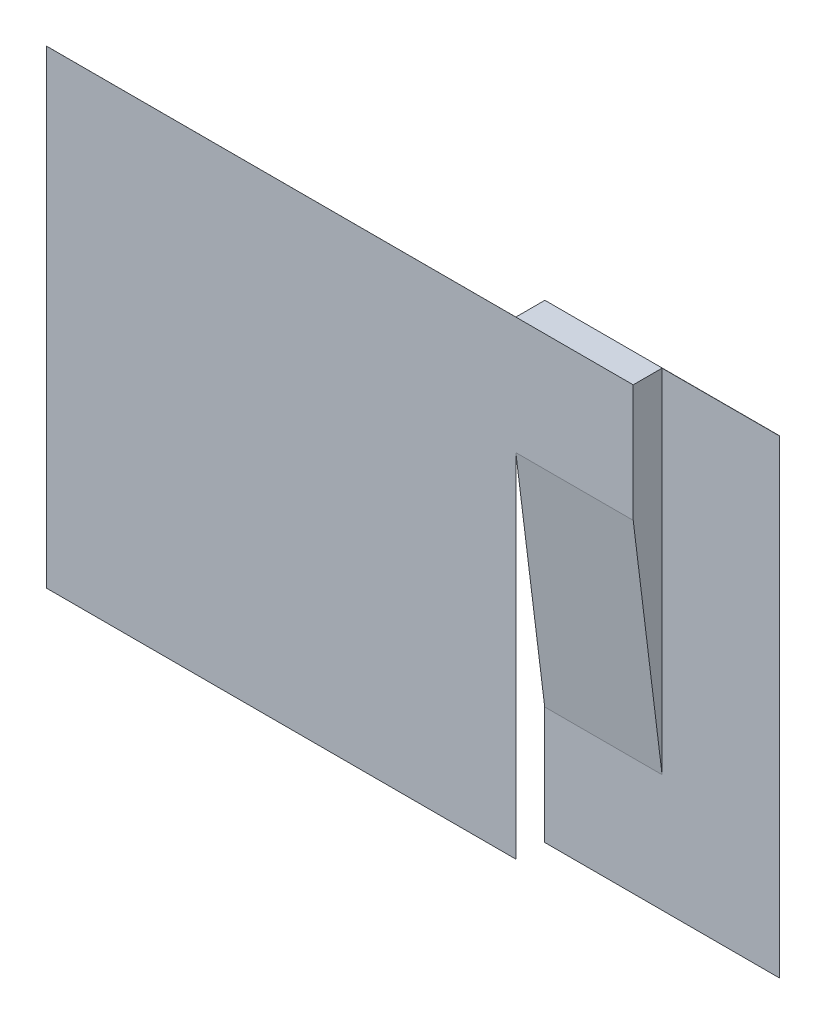
ISO-10303-21;
HEADER;
FILE_DESCRIPTION(('STEP AP214'),'2;1');
FILE_NAME('part.step','',(''),(''),'','','');
FILE_SCHEMA(('AUTOMOTIVE_DESIGN { 1 0 10303 214 1 1 1 1 }'));
ENDSEC;
DATA;
#1=APPLICATION_CONTEXT('core data for automotive mechanical design processes');
#2=APPLICATION_PROTOCOL_DEFINITION('international standard','automotive_design',2000,#1);
#3=PRODUCT_CONTEXT('',#1,'mechanical');
#4=PRODUCT('Part','Part','',(#3));
#5=PRODUCT_RELATED_PRODUCT_CATEGORY('part','',(#4));
#6=PRODUCT_DEFINITION_FORMATION('','',#4);
#7=PRODUCT_DEFINITION_CONTEXT('part definition',#1,'design');
#8=PRODUCT_DEFINITION('design','',#6,#7);
#9=PRODUCT_DEFINITION_SHAPE('','',#8);
#10=(LENGTH_UNIT() NAMED_UNIT(*) SI_UNIT(.MILLI.,.METRE.));
#11=(NAMED_UNIT(*) PLANE_ANGLE_UNIT() SI_UNIT($,.RADIAN.));
#12=(NAMED_UNIT(*) SI_UNIT($,.STERADIAN.) SOLID_ANGLE_UNIT());
#13=UNCERTAINTY_MEASURE_WITH_UNIT(LENGTH_MEASURE(1.E-05),#10,'distance_accuracy_value','');
#14=(GEOMETRIC_REPRESENTATION_CONTEXT(3) GLOBAL_UNCERTAINTY_ASSIGNED_CONTEXT((#13)) GLOBAL_UNIT_ASSIGNED_CONTEXT((#10,
#11,#12)) REPRESENTATION_CONTEXT('',''));
#15=CARTESIAN_POINT('',(0.,0.,0.));
#16=DIRECTION('',(0.,0.,1.));
#17=DIRECTION('',(1.,0.,0.));
#18=AXIS2_PLACEMENT_3D('',#15,#16,#17);
#19=CARTESIAN_POINT('',(305.,-1291.8204832077,-424.609273672104));
#20=DIRECTION('',(0.,-0.122031907108363,0.992526177814719));
#21=DIRECTION('',(0.,-0.992526177814719,-0.122031907108363));
#22=AXIS2_PLACEMENT_3D('',#19,#20,#21);
#23=PLANE('',#22);
#24=DIRECTION('',(0.,-0.992526177814719,-0.122031907108363));
#25=VECTOR('',#24,1.);
#26=CARTESIAN_POINT('',(-305.,-1291.8204832077,-424.609273672104));
#27=LINE('',#26,#25);
#28=CARTESIAN_POINT('',(-305.,-72.6338165409989,-274.709273672104));
#29=VERTEX_POINT('',#28);
#30=CARTESIAN_POINT('',(-305.,-71.8204832076668,-274.609273672104));
#31=VERTEX_POINT('',#30);
#32=EDGE_CURVE('E136',#29,#31,#27,.F.);
#33=ORIENTED_EDGE('',*,*,#32,.F.);
#34=DIRECTION('',(0.,-0.992526177814719,-0.122031907108363));
#35=VECTOR('',#34,1.);
#36=CARTESIAN_POINT('',(-305.,-1291.8204832077,-424.609273672104));
#37=LINE('',#36,#35);
#38=CARTESIAN_POINT('',(-305.,-1291.8204832077,-424.609273672104));
#39=VERTEX_POINT('',#38);
#40=EDGE_CURVE('E36',#39,#29,#37,.F.);
#41=ORIENTED_EDGE('',*,*,#40,.F.);
#42=DIRECTION('',(-1.,0.,0.));
#43=VECTOR('',#42,1.);
#44=CARTESIAN_POINT('',(305.,-1291.8204832077,-424.609273672104));
#45=LINE('',#44,#43);
#46=CARTESIAN_POINT('',(305.,-1291.8204832077,-424.609273672104));
#47=VERTEX_POINT('',#46);
#48=EDGE_CURVE('E140',#47,#39,#45,.T.);
#49=ORIENTED_EDGE('',*,*,#48,.F.);
#50=DIRECTION('',(0.,0.992526177814719,0.122031907108363));
#51=VECTOR('',#50,1.);
#52=CARTESIAN_POINT('',(305.,-1291.8204832077,-424.609273672104));
#53=LINE('',#52,#51);
#54=CARTESIAN_POINT('',(305.,-71.8204832076659,-274.609273672104));
#55=VERTEX_POINT('',#54);
#56=EDGE_CURVE('E139',#55,#47,#53,.F.);
#57=ORIENTED_EDGE('',*,*,#56,.F.);
#58=DIRECTION('',(-1.,0.,0.));
#59=VECTOR('',#58,1.);
#60=CARTESIAN_POINT('',(304.999999999998,-71.8204832076659,-274.609273672104));
#61=LINE('',#60,#59);
#62=EDGE_CURVE('E69',#31,#55,#61,.F.);
#63=ORIENTED_EDGE('',*,*,#62,.F.);
#64=EDGE_LOOP('',(#33,#41,#49,#57,#63));
#65=FACE_BOUND('',#64,.T.);
#66=ADVANCED_FACE('F33',(#65),#23,.T.);
#67=CARTESIAN_POINT('',(0.,0.,-424.609273672104));
#68=DIRECTION('',(0.,0.,-1.));
#69=DIRECTION('',(-1.,0.,0.));
#70=AXIS2_PLACEMENT_3D('',#67,#68,#69);
#71=PLANE('',#70);
#72=DIRECTION('',(0.,1.,0.));
#73=VECTOR('',#72,1.);
#74=CARTESIAN_POINT('',(305.,-1291.8204832077,-424.609273672104));
#75=LINE('',#74,#73);
#76=CARTESIAN_POINT('',(305.,538.179516792297,-424.609273672104));
#77=VERTEX_POINT('',#76);
#78=EDGE_CURVE('E80',#47,#77,#75,.T.);
#79=ORIENTED_EDGE('',*,*,#78,.F.);
#80=ORIENTED_EDGE('',*,*,#48,.T.);
#81=DIRECTION('',(0.,1.,0.));
#82=VECTOR('',#81,1.);
#83=CARTESIAN_POINT('',(-305.,-1901.82048320771,-424.609273672104));
#84=LINE('',#83,#82);
#85=CARTESIAN_POINT('',(-305.,-1901.82048320771,-424.609273672104));
#86=VERTEX_POINT('',#85);
#87=EDGE_CURVE('E162',#86,#39,#84,.T.);
#88=ORIENTED_EDGE('',*,*,#87,.F.);
#89=DIRECTION('',(-1.,0.,0.));
#90=VECTOR('',#89,1.);
#91=CARTESIAN_POINT('',(915.,-1901.82048320771,-424.609273672104));
#92=LINE('',#91,#90);
#93=CARTESIAN_POINT('',(915.,-1901.82048320771,-424.609273672104));
#94=VERTEX_POINT('',#93);
#95=EDGE_CURVE('E127',#94,#86,#92,.T.);
#96=ORIENTED_EDGE('',*,*,#95,.F.);
#97=DIRECTION('',(0.,-1.,0.));
#98=VECTOR('',#97,1.);
#99=CARTESIAN_POINT('',(915.,538.179516792297,-424.609273672104));
#100=LINE('',#99,#98);
#101=CARTESIAN_POINT('',(915.,538.179516792297,-424.609273672104));
#102=VERTEX_POINT('',#101);
#103=EDGE_CURVE('E125',#102,#94,#100,.T.);
#104=ORIENTED_EDGE('',*,*,#103,.F.);
#105=DIRECTION('',(1.,0.,0.));
#106=VECTOR('',#105,1.);
#107=CARTESIAN_POINT('',(-305.,538.179516792297,-424.609273672104));
#108=LINE('',#107,#106);
#109=EDGE_CURVE('E108',#77,#102,#108,.T.);
#110=ORIENTED_EDGE('',*,*,#109,.F.);
#111=EDGE_LOOP('',(#79,#80,#88,#96,#104,#110));
#112=FACE_BOUND('',#111,.T.);
#113=ADVANCED_FACE('F234',(#112),#71,.F.);
#114=CARTESIAN_POINT('',(915.,538.179516792297,-424.609273672104));
#115=DIRECTION('',(1.,0.,0.));
#116=DIRECTION('',(0.,0.,-1.));
#117=AXIS2_PLACEMENT_3D('',#114,#115,#116);
#118=PLANE('',#117);
#119=DIRECTION('',(0.,-1.,0.));
#120=VECTOR('',#119,1.);
#121=CARTESIAN_POINT('',(915.,538.179516792297,-425.609273672104));
#122=LINE('',#121,#120);
#123=CARTESIAN_POINT('',(915.,538.179516792297,-425.609273672104));
#124=VERTEX_POINT('',#123);
#125=CARTESIAN_POINT('',(915.,-1901.82048320771,-425.609273672104));
#126=VERTEX_POINT('',#125);
#127=EDGE_CURVE('E113',#124,#126,#122,.T.);
#128=ORIENTED_EDGE('',*,*,#127,.F.);
#129=DIRECTION('',(0.,0.,-1.));
#130=VECTOR('',#129,1.);
#131=CARTESIAN_POINT('',(915.,538.179516792297,-424.609273672104));
#132=LINE('',#131,#130);
#133=EDGE_CURVE('E11',#102,#124,#132,.T.);
#134=ORIENTED_EDGE('',*,*,#133,.F.);
#135=ORIENTED_EDGE('',*,*,#103,.T.);
#136=DIRECTION('',(0.,0.,-1.));
#137=VECTOR('',#136,1.);
#138=CARTESIAN_POINT('',(915.,-1901.82048320771,-424.609273672104));
#139=LINE('',#138,#137);
#140=EDGE_CURVE('E115',#94,#126,#139,.T.);
#141=ORIENTED_EDGE('',*,*,#140,.T.);
#142=EDGE_LOOP('',(#128,#134,#135,#141));
#143=FACE_BOUND('',#142,.T.);
#144=ADVANCED_FACE('F114',(#143),#118,.T.);
#145=CARTESIAN_POINT('',(-305.,538.179516792297,-424.609273672104));
#146=DIRECTION('',(0.,1.,0.));
#147=DIRECTION('',(0.,0.,1.));
#148=AXIS2_PLACEMENT_3D('',#145,#146,#147);
#149=PLANE('',#148);
#150=DIRECTION('',(1.,0.,0.));
#151=VECTOR('',#150,1.);
#152=CARTESIAN_POINT('',(-305.,538.179516792297,-425.609273672104));
#153=LINE('',#152,#151);
#154=CARTESIAN_POINT('',(-305.,538.179516792297,-425.609273672104));
#155=VERTEX_POINT('',#154);
#156=EDGE_CURVE('E106',#155,#124,#153,.T.);
#157=ORIENTED_EDGE('',*,*,#156,.F.);
#158=DIRECTION('',(0.,0.,-1.));
#159=VECTOR('',#158,1.);
#160=CARTESIAN_POINT('',(-305.,538.179516792297,-424.609273672104));
#161=LINE('',#160,#159);
#162=CARTESIAN_POINT('',(-305.,538.179516792297,-274.709273672104));
#163=VERTEX_POINT('',#162);
#164=EDGE_CURVE('E42',#163,#155,#161,.T.);
#165=ORIENTED_EDGE('',*,*,#164,.F.);
#166=DIRECTION('',(1.,0.,0.));
#167=VECTOR('',#166,1.);
#168=CARTESIAN_POINT('',(-2745.,538.179516792298,-274.709273672104));
#169=LINE('',#168,#167);
#170=CARTESIAN_POINT('',(-2745.,538.179516792298,-274.709273672104));
#171=VERTEX_POINT('',#170);
#172=EDGE_CURVE('E152',#171,#163,#169,.T.);
#173=ORIENTED_EDGE('',*,*,#172,.F.);
#174=DIRECTION('',(0.,0.,-1.));
#175=VECTOR('',#174,1.);
#176=CARTESIAN_POINT('',(-2745.,538.179516792298,-274.709273672104));
#177=LINE('',#176,#175);
#178=CARTESIAN_POINT('',(-2745.,538.179516792298,-274.609273672104));
#179=VERTEX_POINT('',#178);
#180=EDGE_CURVE('E178',#179,#171,#177,.T.);
#181=ORIENTED_EDGE('',*,*,#180,.F.);
#182=DIRECTION('',(1.,0.,0.));
#183=VECTOR('',#182,1.);
#184=CARTESIAN_POINT('',(-305.,538.179516792297,-274.609273672104));
#185=LINE('',#184,#183);
#186=CARTESIAN_POINT('',(305.,538.179516792297,-274.609273672104));
#187=VERTEX_POINT('',#186);
#188=EDGE_CURVE('E154',#179,#187,#185,.T.);
#189=ORIENTED_EDGE('',*,*,#188,.T.);
#190=DIRECTION('',(0.,0.,-1.));
#191=VECTOR('',#190,1.);
#192=CARTESIAN_POINT('',(305.,538.179516792297,-274.609273672104));
#193=LINE('',#192,#191);
#194=EDGE_CURVE('E157',#187,#77,#193,.T.);
#195=ORIENTED_EDGE('',*,*,#194,.T.);
#196=ORIENTED_EDGE('',*,*,#109,.T.);
#197=ORIENTED_EDGE('',*,*,#133,.T.);
#198=EDGE_LOOP('',(#157,#165,#173,#181,#189,#195,#196,#197));
#199=FACE_BOUND('',#198,.T.);
#200=ADVANCED_FACE('F104',(#199),#149,.T.);
#201=CARTESIAN_POINT('',(-305.,-1901.82048320771,-424.609273672104));
#202=DIRECTION('',(-1.,0.,0.));
#203=DIRECTION('',(0.,0.,1.));
#204=AXIS2_PLACEMENT_3D('',#201,#202,#203);
#205=PLANE('',#204);
#206=DIRECTION('',(0.,-1.,0.));
#207=VECTOR('',#206,1.);
#208=CARTESIAN_POINT('',(-305.,-1291.8204832077,-274.709273672104));
#209=LINE('',#208,#207);
#210=EDGE_CURVE('E51',#163,#29,#209,.T.);
#211=ORIENTED_EDGE('',*,*,#210,.F.);
#212=ORIENTED_EDGE('',*,*,#164,.T.);
#213=DIRECTION('',(0.,1.,0.));
#214=VECTOR('',#213,1.);
#215=CARTESIAN_POINT('',(-305.,-1901.82048320771,-425.609273672104));
#216=LINE('',#215,#214);
#217=CARTESIAN_POINT('',(-305.,-1901.82048320771,-425.609273672104));
#218=VERTEX_POINT('',#217);
#219=EDGE_CURVE('E124',#218,#155,#216,.T.);
#220=ORIENTED_EDGE('',*,*,#219,.F.);
#221=DIRECTION('',(0.,0.,-1.));
#222=VECTOR('',#221,1.);
#223=CARTESIAN_POINT('',(-305.,-1901.82048320771,-424.609273672104));
#224=LINE('',#223,#222);
#225=EDGE_CURVE('E133',#86,#218,#224,.T.);
#226=ORIENTED_EDGE('',*,*,#225,.F.);
#227=ORIENTED_EDGE('',*,*,#87,.T.);
#228=ORIENTED_EDGE('',*,*,#40,.T.);
#229=EDGE_LOOP('',(#211,#212,#220,#226,#227,#228));
#230=FACE_BOUND('',#229,.T.);
#231=ADVANCED_FACE('F167',(#230),#205,.T.);
#232=CARTESIAN_POINT('',(915.,-1901.82048320771,-424.609273672104));
#233=DIRECTION('',(0.,-1.,0.));
#234=DIRECTION('',(0.,0.,-1.));
#235=AXIS2_PLACEMENT_3D('',#232,#233,#234);
#236=PLANE('',#235);
#237=DIRECTION('',(-1.,0.,0.));
#238=VECTOR('',#237,1.);
#239=CARTESIAN_POINT('',(915.,-1901.82048320771,-425.609273672104));
#240=LINE('',#239,#238);
#241=EDGE_CURVE('E119',#126,#218,#240,.T.);
#242=ORIENTED_EDGE('',*,*,#241,.F.);
#243=ORIENTED_EDGE('',*,*,#140,.F.);
#244=ORIENTED_EDGE('',*,*,#95,.T.);
#245=ORIENTED_EDGE('',*,*,#225,.T.);
#246=EDGE_LOOP('',(#242,#243,#244,#245));
#247=FACE_BOUND('',#246,.T.);
#248=ADVANCED_FACE('F165',(#247),#236,.T.);
#249=CARTESIAN_POINT('',(0.,0.,-425.609273672104));
#250=DIRECTION('',(0.,0.,-1.));
#251=DIRECTION('',(-1.,0.,0.));
#252=AXIS2_PLACEMENT_3D('',#249,#250,#251);
#253=PLANE('',#252);
#254=ORIENTED_EDGE('',*,*,#127,.T.);
#255=ORIENTED_EDGE('',*,*,#241,.T.);
#256=ORIENTED_EDGE('',*,*,#219,.T.);
#257=ORIENTED_EDGE('',*,*,#156,.T.);
#258=EDGE_LOOP('',(#254,#255,#256,#257));
#259=FACE_BOUND('',#258,.T.);
#260=ADVANCED_FACE('F122',(#259),#253,.T.);
#261=CARTESIAN_POINT('',(305.,-1291.8204832077,-274.609273672104));
#262=DIRECTION('',(1.,0.,0.));
#263=DIRECTION('',(0.,0.,-1.));
#264=AXIS2_PLACEMENT_3D('',#261,#262,#263);
#265=PLANE('',#264);
#266=ORIENTED_EDGE('',*,*,#194,.F.);
#267=DIRECTION('',(0.,1.,0.));
#268=VECTOR('',#267,1.);
#269=CARTESIAN_POINT('',(305.,-1291.8204832077,-274.609273672104));
#270=LINE('',#269,#268);
#271=EDGE_CURVE('E144',#55,#187,#270,.T.);
#272=ORIENTED_EDGE('',*,*,#271,.F.);
#273=ORIENTED_EDGE('',*,*,#56,.T.);
#274=ORIENTED_EDGE('',*,*,#78,.T.);
#275=EDGE_LOOP('',(#266,#272,#273,#274));
#276=FACE_BOUND('',#275,.T.);
#277=ADVANCED_FACE('F223',(#276),#265,.T.);
#278=CARTESIAN_POINT('',(-305.,-1291.8204832077,-274.609273672104));
#279=DIRECTION('',(0.,0.,1.));
#280=DIRECTION('',(1.,0.,0.));
#281=AXIS2_PLACEMENT_3D('',#278,#279,#280);
#282=PLANE('',#281);
#283=ORIENTED_EDGE('',*,*,#188,.F.);
#284=DIRECTION('',(0.,1.,0.));
#285=VECTOR('',#284,1.);
#286=CARTESIAN_POINT('',(-2745.,538.179516792298,-274.609273672104));
#287=LINE('',#286,#285);
#288=CARTESIAN_POINT('',(-2745.,-1901.82048320771,-274.609273672104));
#289=VERTEX_POINT('',#288);
#290=EDGE_CURVE('E183',#289,#179,#287,.T.);
#291=ORIENTED_EDGE('',*,*,#290,.F.);
#292=DIRECTION('',(-1.,0.,0.));
#293=VECTOR('',#292,1.);
#294=CARTESIAN_POINT('',(-2745.,-1901.82048320771,-274.609273672104));
#295=LINE('',#294,#293);
#296=CARTESIAN_POINT('',(-305.,-1901.82048320771,-274.609273672104));
#297=VERTEX_POINT('',#296);
#298=EDGE_CURVE('E194',#297,#289,#295,.T.);
#299=ORIENTED_EDGE('',*,*,#298,.F.);
#300=DIRECTION('',(0.,1.,0.));
#301=VECTOR('',#300,1.);
#302=CARTESIAN_POINT('',(-305.,-1901.82048320771,-274.609273672104));
#303=LINE('',#302,#301);
#304=EDGE_CURVE('E189',#297,#31,#303,.T.);
#305=ORIENTED_EDGE('',*,*,#304,.T.);
#306=ORIENTED_EDGE('',*,*,#62,.T.);
#307=ORIENTED_EDGE('',*,*,#271,.T.);
#308=EDGE_LOOP('',(#283,#291,#299,#305,#306,#307));
#309=FACE_BOUND('',#308,.T.);
#310=ADVANCED_FACE('F222',(#309),#282,.T.);
#311=CARTESIAN_POINT('',(-2745.,-1291.8204832077,-274.709273672104));
#312=DIRECTION('',(0.,0.,1.));
#313=DIRECTION('',(0.,-1.,0.));
#314=AXIS2_PLACEMENT_3D('',#311,#312,#313);
#315=PLANE('',#314);
#316=ORIENTED_EDGE('',*,*,#210,.T.);
#317=DIRECTION('',(0.,1.,0.));
#318=VECTOR('',#317,1.);
#319=CARTESIAN_POINT('',(-305.,-1901.82048320771,-274.709273672104));
#320=LINE('',#319,#318);
#321=CARTESIAN_POINT('',(-305.,-1901.82048320771,-274.709273672104));
#322=VERTEX_POINT('',#321);
#323=EDGE_CURVE('E186',#322,#29,#320,.T.);
#324=ORIENTED_EDGE('',*,*,#323,.F.);
#325=DIRECTION('',(1.,0.,0.));
#326=VECTOR('',#325,1.);
#327=CARTESIAN_POINT('',(-305.,-1901.82048320771,-274.709273672104));
#328=LINE('',#327,#326);
#329=CARTESIAN_POINT('',(-2745.,-1901.82048320771,-274.709273672104));
#330=VERTEX_POINT('',#329);
#331=EDGE_CURVE('E202',#330,#322,#328,.T.);
#332=ORIENTED_EDGE('',*,*,#331,.F.);
#333=DIRECTION('',(0.,-1.,0.));
#334=VECTOR('',#333,1.);
#335=CARTESIAN_POINT('',(-2745.,-1291.8204832077,-274.709273672104));
#336=LINE('',#335,#334);
#337=EDGE_CURVE('E177',#171,#330,#336,.T.);
#338=ORIENTED_EDGE('',*,*,#337,.F.);
#339=ORIENTED_EDGE('',*,*,#172,.T.);
#340=EDGE_LOOP('',(#316,#324,#332,#338,#339));
#341=FACE_BOUND('',#340,.T.);
#342=ADVANCED_FACE('F173',(#341),#315,.F.);
#343=CARTESIAN_POINT('',(-2745.,0.,0.));
#344=DIRECTION('',(1.,0.,0.));
#345=DIRECTION('',(0.,0.,-1.));
#346=AXIS2_PLACEMENT_3D('',#343,#344,#345);
#347=PLANE('',#346);
#348=ORIENTED_EDGE('',*,*,#290,.T.);
#349=ORIENTED_EDGE('',*,*,#180,.T.);
#350=ORIENTED_EDGE('',*,*,#337,.T.);
#351=DIRECTION('',(0.,0.,-1.));
#352=VECTOR('',#351,1.);
#353=CARTESIAN_POINT('',(-2745.,-1901.82048320771,-274.709273672104));
#354=LINE('',#353,#352);
#355=EDGE_CURVE('E138',#289,#330,#354,.T.);
#356=ORIENTED_EDGE('',*,*,#355,.F.);
#357=EDGE_LOOP('',(#348,#349,#350,#356));
#358=FACE_BOUND('',#357,.T.);
#359=ADVANCED_FACE('F212',(#358),#347,.F.);
#360=CARTESIAN_POINT('',(-305.,-1901.82048320771,-274.609273672104));
#361=DIRECTION('',(-1.,0.,0.));
#362=DIRECTION('',(0.,0.,1.));
#363=AXIS2_PLACEMENT_3D('',#360,#361,#362);
#364=PLANE('',#363);
#365=ORIENTED_EDGE('',*,*,#32,.T.);
#366=ORIENTED_EDGE('',*,*,#304,.F.);
#367=DIRECTION('',(0.,0.,1.));
#368=VECTOR('',#367,1.);
#369=CARTESIAN_POINT('',(-305.,-1901.82048320771,-274.609273672104));
#370=LINE('',#369,#368);
#371=EDGE_CURVE('E199',#322,#297,#370,.T.);
#372=ORIENTED_EDGE('',*,*,#371,.F.);
#373=ORIENTED_EDGE('',*,*,#323,.T.);
#374=EDGE_LOOP('',(#365,#366,#372,#373));
#375=FACE_BOUND('',#374,.T.);
#376=ADVANCED_FACE('F241',(#375),#364,.F.);
#377=CARTESIAN_POINT('',(0.,-1901.82048320771,0.));
#378=DIRECTION('',(0.,1.,0.));
#379=DIRECTION('',(0.,0.,1.));
#380=AXIS2_PLACEMENT_3D('',#377,#378,#379);
#381=PLANE('',#380);
#382=ORIENTED_EDGE('',*,*,#355,.T.);
#383=ORIENTED_EDGE('',*,*,#331,.T.);
#384=ORIENTED_EDGE('',*,*,#371,.T.);
#385=ORIENTED_EDGE('',*,*,#298,.T.);
#386=EDGE_LOOP('',(#382,#383,#384,#385));
#387=FACE_BOUND('',#386,.T.);
#388=ADVANCED_FACE('F207',(#387),#381,.F.);
#389=CLOSED_SHELL('',(#66,#113,#144,#200,#231,#248,#260,#277,#310,#342,#359,#376,#388));
#390=MANIFOLD_SOLID_BREP('B2',#389);
#391=ADVANCED_BREP_SHAPE_REPRESENTATION('',(#18,#390),#14);
#392=SHAPE_DEFINITION_REPRESENTATION(#9,#391);
ENDSEC;
END-ISO-10303-21;
